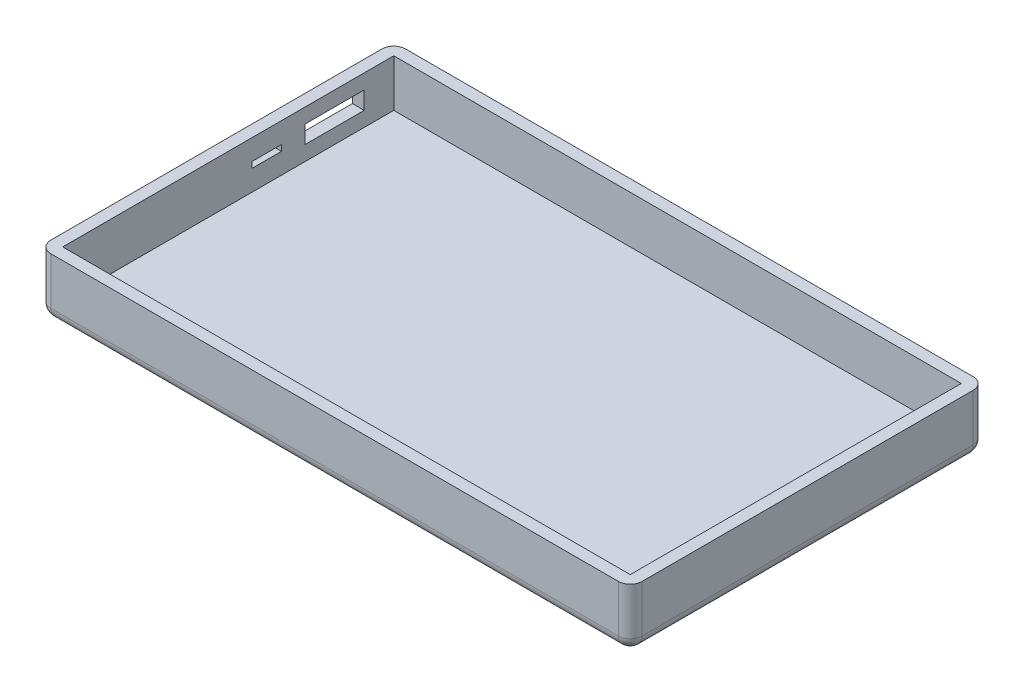
ISO-10303-21;
HEADER;
FILE_DESCRIPTION(('STEP AP214'),'2;1');
FILE_NAME('part.step','',(''),(''),'','','');
FILE_SCHEMA(('AUTOMOTIVE_DESIGN { 1 0 10303 214 1 1 1 1 }'));
ENDSEC;
DATA;
#1=APPLICATION_CONTEXT('core data for automotive mechanical design processes');
#2=APPLICATION_PROTOCOL_DEFINITION('international standard','automotive_design',2000,#1);
#3=PRODUCT_CONTEXT('',#1,'mechanical');
#4=PRODUCT('Part','Part','',(#3));
#5=PRODUCT_RELATED_PRODUCT_CATEGORY('part','',(#4));
#6=PRODUCT_DEFINITION_FORMATION('','',#4);
#7=PRODUCT_DEFINITION_CONTEXT('part definition',#1,'design');
#8=PRODUCT_DEFINITION('design','',#6,#7);
#9=PRODUCT_DEFINITION_SHAPE('','',#8);
#10=(LENGTH_UNIT() NAMED_UNIT(*) SI_UNIT(.MILLI.,.METRE.));
#11=(NAMED_UNIT(*) PLANE_ANGLE_UNIT() SI_UNIT($,.RADIAN.));
#12=(NAMED_UNIT(*) SI_UNIT($,.STERADIAN.) SOLID_ANGLE_UNIT());
#13=UNCERTAINTY_MEASURE_WITH_UNIT(LENGTH_MEASURE(1.E-05),#10,'distance_accuracy_value','');
#14=(GEOMETRIC_REPRESENTATION_CONTEXT(3) GLOBAL_UNCERTAINTY_ASSIGNED_CONTEXT((#13)) GLOBAL_UNIT_ASSIGNED_CONTEXT((#10,
#11,#12)) REPRESENTATION_CONTEXT('',''));
#15=CARTESIAN_POINT('',(0.,0.,0.));
#16=DIRECTION('',(0.,0.,1.));
#17=DIRECTION('',(1.,0.,0.));
#18=AXIS2_PLACEMENT_3D('',#15,#16,#17);
#19=CARTESIAN_POINT('',(-50.,10.,30.));
#20=DIRECTION('',(1.,0.,0.));
#21=DIRECTION('',(0.,0.,-1.));
#22=AXIS2_PLACEMENT_3D('',#19,#20,#21);
#23=PLANE('',#22);
#24=DIRECTION('',(0.,-1.,0.));
#25=VECTOR('',#24,1.);
#26=CARTESIAN_POINT('',(-50.,6.5,-8.99999999999999));
#27=LINE('',#26,#25);
#28=CARTESIAN_POINT('',(-50.,6.5,-8.99999999999999));
#29=VERTEX_POINT('',#28);
#30=CARTESIAN_POINT('',(-50.,5.5,-8.99999999999999));
#31=VERTEX_POINT('',#30);
#32=EDGE_CURVE('E220',#29,#31,#27,.T.);
#33=ORIENTED_EDGE('',*,*,#32,.F.);
#34=DIRECTION('',(0.,0.,-1.));
#35=VECTOR('',#34,1.);
#36=CARTESIAN_POINT('',(-50.,6.5,-8.99999999999999));
#37=LINE('',#36,#35);
#38=CARTESIAN_POINT('',(-50.,6.5,-3.99999999999999));
#39=VERTEX_POINT('',#38);
#40=EDGE_CURVE('E210',#39,#29,#37,.T.);
#41=ORIENTED_EDGE('',*,*,#40,.F.);
#42=DIRECTION('',(0.,1.,0.));
#43=VECTOR('',#42,1.);
#44=CARTESIAN_POINT('',(-50.,6.5,-3.99999999999999));
#45=LINE('',#44,#43);
#46=CARTESIAN_POINT('',(-50.,5.5,-3.99999999999999));
#47=VERTEX_POINT('',#46);
#48=EDGE_CURVE('E224',#47,#39,#45,.T.);
#49=ORIENTED_EDGE('',*,*,#48,.F.);
#50=DIRECTION('',(0.,0.,1.));
#51=VECTOR('',#50,1.);
#52=CARTESIAN_POINT('',(-50.,5.5,-8.99999999999999));
#53=LINE('',#52,#51);
#54=EDGE_CURVE('E57',#31,#47,#53,.T.);
#55=ORIENTED_EDGE('',*,*,#54,.F.);
#56=EDGE_LOOP('',(#33,#41,#49,#55));
#57=FACE_BOUND('',#56,.T.);
#58=DIRECTION('',(0.,1.,0.));
#59=VECTOR('',#58,1.);
#60=CARTESIAN_POINT('',(-50.,4.5,-13.));
#61=LINE('',#60,#59);
#62=CARTESIAN_POINT('',(-50.,4.5,-13.));
#63=VERTEX_POINT('',#62);
#64=CARTESIAN_POINT('',(-50.,7.5,-13.));
#65=VERTEX_POINT('',#64);
#66=EDGE_CURVE('E243',#63,#65,#61,.T.);
#67=ORIENTED_EDGE('',*,*,#66,.F.);
#68=DIRECTION('',(0.,0.,1.));
#69=VECTOR('',#68,1.);
#70=CARTESIAN_POINT('',(-50.,4.5,-13.));
#71=LINE('',#70,#69);
#72=CARTESIAN_POINT('',(-50.,4.5,-23.));
#73=VERTEX_POINT('',#72);
#74=EDGE_CURVE('E247',#73,#63,#71,.T.);
#75=ORIENTED_EDGE('',*,*,#74,.F.);
#76=DIRECTION('',(0.,-1.,0.));
#77=VECTOR('',#76,1.);
#78=CARTESIAN_POINT('',(-50.,4.5,-23.));
#79=LINE('',#78,#77);
#80=CARTESIAN_POINT('',(-50.,7.5,-23.));
#81=VERTEX_POINT('',#80);
#82=EDGE_CURVE('E251',#81,#73,#79,.T.);
#83=ORIENTED_EDGE('',*,*,#82,.F.);
#84=DIRECTION('',(0.,0.,-1.));
#85=VECTOR('',#84,1.);
#86=CARTESIAN_POINT('',(-50.,7.5,-13.));
#87=LINE('',#86,#85);
#88=EDGE_CURVE('E65',#65,#81,#87,.T.);
#89=ORIENTED_EDGE('',*,*,#88,.F.);
#90=EDGE_LOOP('',(#67,#75,#83,#89));
#91=FACE_BOUND('',#90,.T.);
#92=DIRECTION('',(0.,0.,1.));
#93=VECTOR('',#92,1.);
#94=CARTESIAN_POINT('',(-50.,2.,30.));
#95=LINE('',#94,#93);
#96=CARTESIAN_POINT('',(-50.,2.,-28.));
#97=VERTEX_POINT('',#96);
#98=CARTESIAN_POINT('',(-50.,2.,28.));
#99=VERTEX_POINT('',#98);
#100=EDGE_CURVE('E366',#97,#99,#95,.T.);
#101=ORIENTED_EDGE('',*,*,#100,.T.);
#102=DIRECTION('',(0.,-1.,0.));
#103=VECTOR('',#102,1.);
#104=CARTESIAN_POINT('',(-50.,10.,28.));
#105=LINE('',#104,#103);
#106=CARTESIAN_POINT('',(-50.,10.,28.));
#107=VERTEX_POINT('',#106);
#108=EDGE_CURVE('E369',#99,#107,#105,.F.);
#109=ORIENTED_EDGE('',*,*,#108,.T.);
#110=DIRECTION('',(0.,0.,1.));
#111=VECTOR('',#110,1.);
#112=CARTESIAN_POINT('',(-50.,10.,30.));
#113=LINE('',#112,#111);
#114=CARTESIAN_POINT('',(-50.,10.,-28.));
#115=VERTEX_POINT('',#114);
#116=EDGE_CURVE('E291',#115,#107,#113,.T.);
#117=ORIENTED_EDGE('',*,*,#116,.F.);
#118=DIRECTION('',(0.,-1.,0.));
#119=VECTOR('',#118,1.);
#120=CARTESIAN_POINT('',(-50.,10.,-28.));
#121=LINE('',#120,#119);
#122=EDGE_CURVE('E363',#115,#97,#121,.T.);
#123=ORIENTED_EDGE('',*,*,#122,.T.);
#124=EDGE_LOOP('',(#101,#109,#117,#123));
#125=FACE_BOUND('',#124,.T.);
#126=ADVANCED_FACE('F39',(#57,#91,#125),#23,.F.);
#127=CARTESIAN_POINT('',(50.,10.,30.));
#128=DIRECTION('',(0.,0.,-1.));
#129=DIRECTION('',(-1.,0.,0.));
#130=AXIS2_PLACEMENT_3D('',#127,#128,#129);
#131=PLANE('',#130);
#132=DIRECTION('',(1.,0.,0.));
#133=VECTOR('',#132,1.);
#134=CARTESIAN_POINT('',(50.,10.,30.));
#135=LINE('',#134,#133);
#136=CARTESIAN_POINT('',(-48.,10.,30.));
#137=VERTEX_POINT('',#136);
#138=CARTESIAN_POINT('',(48.,10.,30.));
#139=VERTEX_POINT('',#138);
#140=EDGE_CURVE('E328',#137,#139,#135,.T.);
#141=ORIENTED_EDGE('',*,*,#140,.F.);
#142=DIRECTION('',(0.,-1.,0.));
#143=VECTOR('',#142,1.);
#144=CARTESIAN_POINT('',(-48.,10.,30.));
#145=LINE('',#144,#143);
#146=CARTESIAN_POINT('',(-48.,2.,30.));
#147=VERTEX_POINT('',#146);
#148=EDGE_CURVE('E347',#137,#147,#145,.T.);
#149=ORIENTED_EDGE('',*,*,#148,.T.);
#150=DIRECTION('',(1.,0.,0.));
#151=VECTOR('',#150,1.);
#152=CARTESIAN_POINT('',(50.,2.,30.));
#153=LINE('',#152,#151);
#154=CARTESIAN_POINT('',(48.,2.,30.));
#155=VERTEX_POINT('',#154);
#156=EDGE_CURVE('E343',#147,#155,#153,.T.);
#157=ORIENTED_EDGE('',*,*,#156,.T.);
#158=DIRECTION('',(0.,-1.,0.));
#159=VECTOR('',#158,1.);
#160=CARTESIAN_POINT('',(48.,10.,30.));
#161=LINE('',#160,#159);
#162=EDGE_CURVE('E340',#155,#139,#161,.F.);
#163=ORIENTED_EDGE('',*,*,#162,.T.);
#164=EDGE_LOOP('',(#141,#149,#157,#163));
#165=FACE_BOUND('',#164,.T.);
#166=ADVANCED_FACE('F467',(#165),#131,.F.);
#167=CARTESIAN_POINT('',(50.,10.,30.));
#168=DIRECTION('',(-1.,0.,0.));
#169=DIRECTION('',(0.,0.,1.));
#170=AXIS2_PLACEMENT_3D('',#167,#168,#169);
#171=PLANE('',#170);
#172=DIRECTION('',(0.,0.,-1.));
#173=VECTOR('',#172,1.);
#174=CARTESIAN_POINT('',(50.,2.,30.));
#175=LINE('',#174,#173);
#176=CARTESIAN_POINT('',(50.,2.,28.));
#177=VERTEX_POINT('',#176);
#178=CARTESIAN_POINT('',(50.,2.,-28.));
#179=VERTEX_POINT('',#178);
#180=EDGE_CURVE('E49',#177,#179,#175,.T.);
#181=ORIENTED_EDGE('',*,*,#180,.T.);
#182=DIRECTION('',(0.,-1.,0.));
#183=VECTOR('',#182,1.);
#184=CARTESIAN_POINT('',(50.,10.,-28.));
#185=LINE('',#184,#183);
#186=CARTESIAN_POINT('',(50.,10.,-28.));
#187=VERTEX_POINT('',#186);
#188=EDGE_CURVE('E11',#179,#187,#185,.F.);
#189=ORIENTED_EDGE('',*,*,#188,.T.);
#190=DIRECTION('',(0.,0.,-1.));
#191=VECTOR('',#190,1.);
#192=CARTESIAN_POINT('',(50.,10.,30.));
#193=LINE('',#192,#191);
#194=CARTESIAN_POINT('',(50.,10.,28.));
#195=VERTEX_POINT('',#194);
#196=EDGE_CURVE('E332',#195,#187,#193,.T.);
#197=ORIENTED_EDGE('',*,*,#196,.F.);
#198=DIRECTION('',(0.,-1.,0.));
#199=VECTOR('',#198,1.);
#200=CARTESIAN_POINT('',(50.,10.,28.));
#201=LINE('',#200,#199);
#202=EDGE_CURVE('E393',#195,#177,#201,.T.);
#203=ORIENTED_EDGE('',*,*,#202,.T.);
#204=EDGE_LOOP('',(#181,#189,#197,#203));
#205=FACE_BOUND('',#204,.T.);
#206=ADVANCED_FACE('F477',(#205),#171,.F.);
#207=CARTESIAN_POINT('',(50.,10.,-30.));
#208=DIRECTION('',(0.,0.,1.));
#209=DIRECTION('',(1.,0.,0.));
#210=AXIS2_PLACEMENT_3D('',#207,#208,#209);
#211=PLANE('',#210);
#212=DIRECTION('',(-1.,0.,0.));
#213=VECTOR('',#212,1.);
#214=CARTESIAN_POINT('',(50.,2.,-30.));
#215=LINE('',#214,#213);
#216=CARTESIAN_POINT('',(48.,2.,-30.));
#217=VERTEX_POINT('',#216);
#218=CARTESIAN_POINT('',(-48.,2.,-30.));
#219=VERTEX_POINT('',#218);
#220=EDGE_CURVE('E387',#217,#219,#215,.T.);
#221=ORIENTED_EDGE('',*,*,#220,.T.);
#222=DIRECTION('',(0.,-1.,0.));
#223=VECTOR('',#222,1.);
#224=CARTESIAN_POINT('',(-48.,10.,-30.));
#225=LINE('',#224,#223);
#226=CARTESIAN_POINT('',(-48.,10.,-30.));
#227=VERTEX_POINT('',#226);
#228=EDGE_CURVE('E390',#219,#227,#225,.F.);
#229=ORIENTED_EDGE('',*,*,#228,.T.);
#230=DIRECTION('',(-1.,0.,0.));
#231=VECTOR('',#230,1.);
#232=CARTESIAN_POINT('',(50.,10.,-30.));
#233=LINE('',#232,#231);
#234=CARTESIAN_POINT('',(48.,10.,-30.));
#235=VERTEX_POINT('',#234);
#236=EDGE_CURVE('E336',#235,#227,#233,.T.);
#237=ORIENTED_EDGE('',*,*,#236,.F.);
#238=DIRECTION('',(0.,-1.,0.));
#239=VECTOR('',#238,1.);
#240=CARTESIAN_POINT('',(48.,10.,-30.));
#241=LINE('',#240,#239);
#242=EDGE_CURVE('E384',#235,#217,#241,.T.);
#243=ORIENTED_EDGE('',*,*,#242,.T.);
#244=EDGE_LOOP('',(#221,#229,#237,#243));
#245=FACE_BOUND('',#244,.T.);
#246=ADVANCED_FACE('F498',(#245),#211,.F.);
#247=CARTESIAN_POINT('',(0.,10.,0.));
#248=DIRECTION('',(0.,1.,0.));
#249=DIRECTION('',(0.,0.,1.));
#250=AXIS2_PLACEMENT_3D('',#247,#248,#249);
#251=PLANE('',#250);
#252=DIRECTION('',(0.,0.,1.));
#253=VECTOR('',#252,1.);
#254=CARTESIAN_POINT('',(-48.,10.,30.));
#255=LINE('',#254,#253);
#256=CARTESIAN_POINT('',(-48.,10.,-28.));
#257=VERTEX_POINT('',#256);
#258=CARTESIAN_POINT('',(-48.,10.,28.));
#259=VERTEX_POINT('',#258);
#260=EDGE_CURVE('E313',#257,#259,#255,.T.);
#261=ORIENTED_EDGE('',*,*,#260,.F.);
#262=DIRECTION('',(-1.,0.,0.));
#263=VECTOR('',#262,1.);
#264=CARTESIAN_POINT('',(50.,10.,-28.));
#265=LINE('',#264,#263);
#266=CARTESIAN_POINT('',(48.,10.,-28.));
#267=VERTEX_POINT('',#266);
#268=EDGE_CURVE('E298',#267,#257,#265,.T.);
#269=ORIENTED_EDGE('',*,*,#268,.F.);
#270=DIRECTION('',(0.,0.,-1.));
#271=VECTOR('',#270,1.);
#272=CARTESIAN_POINT('',(48.,10.,30.));
#273=LINE('',#272,#271);
#274=CARTESIAN_POINT('',(48.,10.,28.));
#275=VERTEX_POINT('',#274);
#276=EDGE_CURVE('E319',#275,#267,#273,.T.);
#277=ORIENTED_EDGE('',*,*,#276,.F.);
#278=DIRECTION('',(1.,0.,0.));
#279=VECTOR('',#278,1.);
#280=CARTESIAN_POINT('',(50.,10.,28.));
#281=LINE('',#280,#279);
#282=EDGE_CURVE('E316',#259,#275,#281,.T.);
#283=ORIENTED_EDGE('',*,*,#282,.F.);
#284=EDGE_LOOP('',(#261,#269,#277,#283));
#285=FACE_BOUND('',#284,.T.);
#286=ORIENTED_EDGE('',*,*,#116,.T.);
#287=CARTESIAN_POINT('',(-48.,10.,28.));
#288=DIRECTION('',(0.,1.,0.));
#289=DIRECTION('',(0.,0.,1.));
#290=AXIS2_PLACEMENT_3D('',#287,#288,#289);
#291=CIRCLE('',#290,2.);
#292=EDGE_CURVE('E381',#107,#137,#291,.T.);
#293=ORIENTED_EDGE('',*,*,#292,.T.);
#294=ORIENTED_EDGE('',*,*,#140,.T.);
#295=CARTESIAN_POINT('',(48.,10.,28.));
#296=DIRECTION('',(0.,1.,0.));
#297=DIRECTION('',(0.,0.,1.));
#298=AXIS2_PLACEMENT_3D('',#295,#296,#297);
#299=CIRCLE('',#298,2.);
#300=EDGE_CURVE('E372',#139,#195,#299,.T.);
#301=ORIENTED_EDGE('',*,*,#300,.T.);
#302=ORIENTED_EDGE('',*,*,#196,.T.);
#303=CARTESIAN_POINT('',(48.,10.,-28.));
#304=DIRECTION('',(0.,1.,0.));
#305=DIRECTION('',(0.,0.,1.));
#306=AXIS2_PLACEMENT_3D('',#303,#304,#305);
#307=CIRCLE('',#306,2.);
#308=EDGE_CURVE('E375',#187,#235,#307,.T.);
#309=ORIENTED_EDGE('',*,*,#308,.T.);
#310=ORIENTED_EDGE('',*,*,#236,.T.);
#311=CARTESIAN_POINT('',(-48.,10.,-28.));
#312=DIRECTION('',(0.,1.,0.));
#313=DIRECTION('',(0.,0.,1.));
#314=AXIS2_PLACEMENT_3D('',#311,#312,#313);
#315=CIRCLE('',#314,2.);
#316=EDGE_CURVE('E378',#227,#115,#315,.T.);
#317=ORIENTED_EDGE('',*,*,#316,.T.);
#318=EDGE_LOOP('',(#286,#293,#294,#301,#302,#309,#310,#317));
#319=FACE_BOUND('',#318,.T.);
#320=ADVANCED_FACE('F464',(#285,#319),#251,.T.);
#321=CARTESIAN_POINT('',(0.,0.,0.));
#322=DIRECTION('',(0.,1.,0.));
#323=DIRECTION('',(0.,0.,1.));
#324=AXIS2_PLACEMENT_3D('',#321,#322,#323);
#325=PLANE('',#324);
#326=DIRECTION('',(0.,0.,-1.));
#327=VECTOR('',#326,1.);
#328=CARTESIAN_POINT('',(48.,0.,0.));
#329=LINE('',#328,#327);
#330=CARTESIAN_POINT('',(48.,0.,-28.));
#331=VERTEX_POINT('',#330);
#332=CARTESIAN_POINT('',(48.,0.,28.));
#333=VERTEX_POINT('',#332);
#334=EDGE_CURVE('E350',#331,#333,#329,.F.);
#335=ORIENTED_EDGE('',*,*,#334,.T.);
#336=DIRECTION('',(1.,0.,0.));
#337=VECTOR('',#336,1.);
#338=CARTESIAN_POINT('',(0.,0.,28.));
#339=LINE('',#338,#337);
#340=CARTESIAN_POINT('',(-48.,0.,28.));
#341=VERTEX_POINT('',#340);
#342=EDGE_CURVE('E359',#333,#341,#339,.F.);
#343=ORIENTED_EDGE('',*,*,#342,.T.);
#344=DIRECTION('',(0.,0.,1.));
#345=VECTOR('',#344,1.);
#346=CARTESIAN_POINT('',(-48.,0.,0.));
#347=LINE('',#346,#345);
#348=CARTESIAN_POINT('',(-48.,0.,-28.));
#349=VERTEX_POINT('',#348);
#350=EDGE_CURVE('E356',#341,#349,#347,.F.);
#351=ORIENTED_EDGE('',*,*,#350,.T.);
#352=DIRECTION('',(-1.,0.,0.));
#353=VECTOR('',#352,1.);
#354=CARTESIAN_POINT('',(0.,0.,-28.));
#355=LINE('',#354,#353);
#356=EDGE_CURVE('E353',#349,#331,#355,.F.);
#357=ORIENTED_EDGE('',*,*,#356,.T.);
#358=EDGE_LOOP('',(#335,#343,#351,#357));
#359=FACE_BOUND('',#358,.T.);
#360=ADVANCED_FACE('F494',(#359),#325,.F.);
#361=CARTESIAN_POINT('',(-48.,10.,30.));
#362=DIRECTION('',(1.,0.,0.));
#363=DIRECTION('',(0.,0.,-1.));
#364=AXIS2_PLACEMENT_3D('',#361,#362,#363);
#365=PLANE('',#364);
#366=DIRECTION('',(0.,0.,-1.));
#367=VECTOR('',#366,1.);
#368=CARTESIAN_POINT('',(-48.,6.5,-8.99999999999999));
#369=LINE('',#368,#367);
#370=CARTESIAN_POINT('',(-48.,6.5,-3.99999999999999));
#371=VERTEX_POINT('',#370);
#372=CARTESIAN_POINT('',(-48.,6.5,-8.99999999999999));
#373=VERTEX_POINT('',#372);
#374=EDGE_CURVE('E207',#371,#373,#369,.T.);
#375=ORIENTED_EDGE('',*,*,#374,.T.);
#376=DIRECTION('',(0.,-1.,0.));
#377=VECTOR('',#376,1.);
#378=CARTESIAN_POINT('',(-48.,6.5,-8.99999999999999));
#379=LINE('',#378,#377);
#380=CARTESIAN_POINT('',(-48.,5.5,-8.99999999999999));
#381=VERTEX_POINT('',#380);
#382=EDGE_CURVE('E192',#373,#381,#379,.T.);
#383=ORIENTED_EDGE('',*,*,#382,.T.);
#384=DIRECTION('',(0.,0.,1.));
#385=VECTOR('',#384,1.);
#386=CARTESIAN_POINT('',(-48.,5.5,-8.99999999999999));
#387=LINE('',#386,#385);
#388=CARTESIAN_POINT('',(-48.,5.5,-3.99999999999999));
#389=VERTEX_POINT('',#388);
#390=EDGE_CURVE('E230',#381,#389,#387,.T.);
#391=ORIENTED_EDGE('',*,*,#390,.T.);
#392=DIRECTION('',(0.,1.,0.));
#393=VECTOR('',#392,1.);
#394=CARTESIAN_POINT('',(-48.,6.5,-3.99999999999999));
#395=LINE('',#394,#393);
#396=EDGE_CURVE('E216',#389,#371,#395,.T.);
#397=ORIENTED_EDGE('',*,*,#396,.T.);
#398=EDGE_LOOP('',(#375,#383,#391,#397));
#399=FACE_BOUND('',#398,.T.);
#400=DIRECTION('',(0.,0.,1.));
#401=VECTOR('',#400,1.);
#402=CARTESIAN_POINT('',(-48.,4.5,-13.));
#403=LINE('',#402,#401);
#404=CARTESIAN_POINT('',(-48.,4.5,-23.));
#405=VERTEX_POINT('',#404);
#406=CARTESIAN_POINT('',(-48.,4.5,-13.));
#407=VERTEX_POINT('',#406);
#408=EDGE_CURVE('E242',#405,#407,#403,.T.);
#409=ORIENTED_EDGE('',*,*,#408,.T.);
#410=DIRECTION('',(0.,1.,0.));
#411=VECTOR('',#410,1.);
#412=CARTESIAN_POINT('',(-48.,4.5,-13.));
#413=LINE('',#412,#411);
#414=CARTESIAN_POINT('',(-48.,7.5,-13.));
#415=VERTEX_POINT('',#414);
#416=EDGE_CURVE('E270',#407,#415,#413,.T.);
#417=ORIENTED_EDGE('',*,*,#416,.T.);
#418=DIRECTION('',(0.,0.,-1.));
#419=VECTOR('',#418,1.);
#420=CARTESIAN_POINT('',(-48.,7.5,-13.));
#421=LINE('',#420,#419);
#422=CARTESIAN_POINT('',(-48.,7.5,-23.));
#423=VERTEX_POINT('',#422);
#424=EDGE_CURVE('E265',#415,#423,#421,.T.);
#425=ORIENTED_EDGE('',*,*,#424,.T.);
#426=DIRECTION('',(0.,-1.,0.));
#427=VECTOR('',#426,1.);
#428=CARTESIAN_POINT('',(-48.,4.5,-23.));
#429=LINE('',#428,#427);
#430=EDGE_CURVE('E259',#423,#405,#429,.T.);
#431=ORIENTED_EDGE('',*,*,#430,.T.);
#432=EDGE_LOOP('',(#409,#417,#425,#431));
#433=FACE_BOUND('',#432,.T.);
#434=DIRECTION('',(0.,0.,1.));
#435=VECTOR('',#434,1.);
#436=CARTESIAN_POINT('',(-48.,2.,30.));
#437=LINE('',#436,#435);
#438=CARTESIAN_POINT('',(-48.,2.,-28.));
#439=VERTEX_POINT('',#438);
#440=CARTESIAN_POINT('',(-48.,2.,28.));
#441=VERTEX_POINT('',#440);
#442=EDGE_CURVE('E282',#439,#441,#437,.T.);
#443=ORIENTED_EDGE('',*,*,#442,.F.);
#444=DIRECTION('',(0.,-1.,0.));
#445=VECTOR('',#444,1.);
#446=CARTESIAN_POINT('',(-48.,10.,-28.));
#447=LINE('',#446,#445);
#448=EDGE_CURVE('E293',#257,#439,#447,.T.);
#449=ORIENTED_EDGE('',*,*,#448,.F.);
#450=ORIENTED_EDGE('',*,*,#260,.T.);
#451=DIRECTION('',(0.,-1.,0.));
#452=VECTOR('',#451,1.);
#453=CARTESIAN_POINT('',(-48.,10.,28.));
#454=LINE('',#453,#452);
#455=EDGE_CURVE('E287',#259,#441,#454,.T.);
#456=ORIENTED_EDGE('',*,*,#455,.T.);
#457=EDGE_LOOP('',(#443,#449,#450,#456));
#458=FACE_BOUND('',#457,.T.);
#459=ADVANCED_FACE('F214',(#399,#433,#458),#365,.T.);
#460=CARTESIAN_POINT('',(50.,10.,28.));
#461=DIRECTION('',(0.,0.,-1.));
#462=DIRECTION('',(-1.,0.,0.));
#463=AXIS2_PLACEMENT_3D('',#460,#461,#462);
#464=PLANE('',#463);
#465=DIRECTION('',(1.,0.,0.));
#466=VECTOR('',#465,1.);
#467=CARTESIAN_POINT('',(50.,2.,28.));
#468=LINE('',#467,#466);
#469=CARTESIAN_POINT('',(48.,2.,28.));
#470=VERTEX_POINT('',#469);
#471=EDGE_CURVE('E286',#441,#470,#468,.T.);
#472=ORIENTED_EDGE('',*,*,#471,.F.);
#473=ORIENTED_EDGE('',*,*,#455,.F.);
#474=ORIENTED_EDGE('',*,*,#282,.T.);
#475=DIRECTION('',(0.,-1.,0.));
#476=VECTOR('',#475,1.);
#477=CARTESIAN_POINT('',(48.,10.,28.));
#478=LINE('',#477,#476);
#479=EDGE_CURVE('E292',#275,#470,#478,.T.);
#480=ORIENTED_EDGE('',*,*,#479,.T.);
#481=EDGE_LOOP('',(#472,#473,#474,#480));
#482=FACE_BOUND('',#481,.T.);
#483=ADVANCED_FACE('F713',(#482),#464,.T.);
#484=CARTESIAN_POINT('',(48.,10.,30.));
#485=DIRECTION('',(-1.,0.,0.));
#486=DIRECTION('',(0.,0.,1.));
#487=AXIS2_PLACEMENT_3D('',#484,#485,#486);
#488=PLANE('',#487);
#489=DIRECTION('',(0.,0.,-1.));
#490=VECTOR('',#489,1.);
#491=CARTESIAN_POINT('',(48.,2.,30.));
#492=LINE('',#491,#490);
#493=CARTESIAN_POINT('',(48.,2.,-28.));
#494=VERTEX_POINT('',#493);
#495=EDGE_CURVE('E301',#470,#494,#492,.T.);
#496=ORIENTED_EDGE('',*,*,#495,.F.);
#497=ORIENTED_EDGE('',*,*,#479,.F.);
#498=ORIENTED_EDGE('',*,*,#276,.T.);
#499=DIRECTION('',(0.,-1.,0.));
#500=VECTOR('',#499,1.);
#501=CARTESIAN_POINT('',(48.,10.,-28.));
#502=LINE('',#501,#500);
#503=EDGE_CURVE('E297',#267,#494,#502,.T.);
#504=ORIENTED_EDGE('',*,*,#503,.T.);
#505=EDGE_LOOP('',(#496,#497,#498,#504));
#506=FACE_BOUND('',#505,.T.);
#507=ADVANCED_FACE('F704',(#506),#488,.T.);
#508=CARTESIAN_POINT('',(50.,10.,-28.));
#509=DIRECTION('',(0.,0.,1.));
#510=DIRECTION('',(1.,0.,0.));
#511=AXIS2_PLACEMENT_3D('',#508,#509,#510);
#512=PLANE('',#511);
#513=DIRECTION('',(-1.,0.,0.));
#514=VECTOR('',#513,1.);
#515=CARTESIAN_POINT('',(50.,2.,-28.));
#516=LINE('',#515,#514);
#517=EDGE_CURVE('E307',#494,#439,#516,.T.);
#518=ORIENTED_EDGE('',*,*,#517,.F.);
#519=ORIENTED_EDGE('',*,*,#503,.F.);
#520=ORIENTED_EDGE('',*,*,#268,.T.);
#521=ORIENTED_EDGE('',*,*,#448,.T.);
#522=EDGE_LOOP('',(#518,#519,#520,#521));
#523=FACE_BOUND('',#522,.T.);
#524=ADVANCED_FACE('F508',(#523),#512,.T.);
#525=CARTESIAN_POINT('',(0.,2.,0.));
#526=DIRECTION('',(0.,1.,0.));
#527=DIRECTION('',(0.,0.,1.));
#528=AXIS2_PLACEMENT_3D('',#525,#526,#527);
#529=PLANE('',#528);
#530=ORIENTED_EDGE('',*,*,#442,.T.);
#531=ORIENTED_EDGE('',*,*,#471,.T.);
#532=ORIENTED_EDGE('',*,*,#495,.T.);
#533=ORIENTED_EDGE('',*,*,#517,.T.);
#534=EDGE_LOOP('',(#530,#531,#532,#533));
#535=FACE_BOUND('',#534,.T.);
#536=ADVANCED_FACE('F503',(#535),#529,.T.);
#537=CARTESIAN_POINT('',(-48.,10.,-28.));
#538=DIRECTION('',(0.,-1.,0.));
#539=DIRECTION('',(0.,0.,-1.));
#540=AXIS2_PLACEMENT_3D('',#537,#538,#539);
#541=CYLINDRICAL_SURFACE('',#540,2.);
#542=ORIENTED_EDGE('',*,*,#316,.F.);
#543=ORIENTED_EDGE('',*,*,#228,.F.);
#544=CARTESIAN_POINT('',(-48.,2.,-28.));
#545=DIRECTION('',(0.,-1.,0.));
#546=DIRECTION('',(0.,0.,-1.));
#547=AXIS2_PLACEMENT_3D('',#544,#545,#546);
#548=CIRCLE('',#547,2.);
#549=EDGE_CURVE('E434',#97,#219,#548,.T.);
#550=ORIENTED_EDGE('',*,*,#549,.F.);
#551=ORIENTED_EDGE('',*,*,#122,.F.);
#552=EDGE_LOOP('',(#542,#543,#550,#551));
#553=FACE_BOUND('',#552,.T.);
#554=ADVANCED_FACE('F41',(#553),#541,.T.);
#555=CARTESIAN_POINT('',(48.,10.,-28.));
#556=DIRECTION('',(0.,-1.,0.));
#557=DIRECTION('',(0.,0.,-1.));
#558=AXIS2_PLACEMENT_3D('',#555,#556,#557);
#559=CYLINDRICAL_SURFACE('',#558,2.);
#560=ORIENTED_EDGE('',*,*,#308,.F.);
#561=ORIENTED_EDGE('',*,*,#188,.F.);
#562=CARTESIAN_POINT('',(48.,2.,-28.));
#563=DIRECTION('',(0.,-1.,0.));
#564=DIRECTION('',(0.,0.,-1.));
#565=AXIS2_PLACEMENT_3D('',#562,#563,#564);
#566=CIRCLE('',#565,2.);
#567=EDGE_CURVE('E431',#217,#179,#566,.T.);
#568=ORIENTED_EDGE('',*,*,#567,.F.);
#569=ORIENTED_EDGE('',*,*,#242,.F.);
#570=EDGE_LOOP('',(#560,#561,#568,#569));
#571=FACE_BOUND('',#570,.T.);
#572=ADVANCED_FACE('F482',(#571),#559,.T.);
#573=CARTESIAN_POINT('',(50.,2.,-28.));
#574=DIRECTION('',(-1.,0.,0.));
#575=DIRECTION('',(0.,0.,1.));
#576=AXIS2_PLACEMENT_3D('',#573,#574,#575);
#577=CYLINDRICAL_SURFACE('',#576,2.);
#578=CARTESIAN_POINT('',(-48.,2.,-28.));
#579=DIRECTION('',(-1.,0.,0.));
#580=DIRECTION('',(0.,0.,1.));
#581=AXIS2_PLACEMENT_3D('',#578,#579,#580);
#582=CIRCLE('',#581,2.);
#583=EDGE_CURVE('E43',#219,#349,#582,.T.);
#584=ORIENTED_EDGE('',*,*,#583,.F.);
#585=ORIENTED_EDGE('',*,*,#220,.F.);
#586=CARTESIAN_POINT('',(48.,2.,-28.));
#587=DIRECTION('',(1.,0.,0.));
#588=DIRECTION('',(0.,0.,-1.));
#589=AXIS2_PLACEMENT_3D('',#586,#587,#588);
#590=CIRCLE('',#589,2.);
#591=EDGE_CURVE('E427',#331,#217,#590,.T.);
#592=ORIENTED_EDGE('',*,*,#591,.F.);
#593=ORIENTED_EDGE('',*,*,#356,.F.);
#594=EDGE_LOOP('',(#584,#585,#592,#593));
#595=FACE_BOUND('',#594,.T.);
#596=ADVANCED_FACE('F495',(#595),#577,.T.);
#597=CARTESIAN_POINT('',(-48.,2.,-28.));
#598=DIRECTION('',(0.,0.,1.));
#599=DIRECTION('',(1.,0.,0.));
#600=AXIS2_PLACEMENT_3D('',#597,#598,#599);
#601=SPHERICAL_SURFACE('',#600,2.);
#602=ORIENTED_EDGE('',*,*,#549,.T.);
#603=ORIENTED_EDGE('',*,*,#583,.T.);
#604=CARTESIAN_POINT('',(-48.,2.,-28.));
#605=DIRECTION('',(0.,0.,-1.));
#606=DIRECTION('',(-1.,0.,0.));
#607=AXIS2_PLACEMENT_3D('',#604,#605,#606);
#608=CIRCLE('',#607,2.);
#609=EDGE_CURVE('E423',#97,#349,#608,.F.);
#610=ORIENTED_EDGE('',*,*,#609,.F.);
#611=EDGE_LOOP('',(#602,#603,#610));
#612=FACE_BOUND('',#611,.T.);
#613=ADVANCED_FACE('F443',(#612),#601,.T.);
#614=CARTESIAN_POINT('',(48.,2.,-28.));
#615=DIRECTION('',(0.,0.,1.));
#616=DIRECTION('',(1.,0.,0.));
#617=AXIS2_PLACEMENT_3D('',#614,#615,#616);
#618=SPHERICAL_SURFACE('',#617,2.);
#619=ORIENTED_EDGE('',*,*,#591,.T.);
#620=ORIENTED_EDGE('',*,*,#567,.T.);
#621=CARTESIAN_POINT('',(48.,2.,-28.));
#622=DIRECTION('',(0.,0.,-1.));
#623=DIRECTION('',(-1.,0.,0.));
#624=AXIS2_PLACEMENT_3D('',#621,#622,#623);
#625=CIRCLE('',#624,2.);
#626=EDGE_CURVE('E419',#331,#179,#625,.F.);
#627=ORIENTED_EDGE('',*,*,#626,.F.);
#628=EDGE_LOOP('',(#619,#620,#627));
#629=FACE_BOUND('',#628,.T.);
#630=ADVANCED_FACE('F486',(#629),#618,.T.);
#631=CARTESIAN_POINT('',(-48.,2.,30.));
#632=DIRECTION('',(0.,0.,1.));
#633=DIRECTION('',(1.,0.,0.));
#634=AXIS2_PLACEMENT_3D('',#631,#632,#633);
#635=CYLINDRICAL_SURFACE('',#634,2.);
#636=ORIENTED_EDGE('',*,*,#609,.T.);
#637=ORIENTED_EDGE('',*,*,#350,.F.);
#638=CARTESIAN_POINT('',(-48.,2.,28.));
#639=DIRECTION('',(0.,0.,1.));
#640=DIRECTION('',(1.,0.,0.));
#641=AXIS2_PLACEMENT_3D('',#638,#639,#640);
#642=CIRCLE('',#641,2.);
#643=EDGE_CURVE('E415',#99,#341,#642,.T.);
#644=ORIENTED_EDGE('',*,*,#643,.F.);
#645=ORIENTED_EDGE('',*,*,#100,.F.);
#646=EDGE_LOOP('',(#636,#637,#644,#645));
#647=FACE_BOUND('',#646,.T.);
#648=ADVANCED_FACE('F450',(#647),#635,.T.);
#649=CARTESIAN_POINT('',(-48.,10.,28.));
#650=DIRECTION('',(0.,-1.,0.));
#651=DIRECTION('',(0.,0.,-1.));
#652=AXIS2_PLACEMENT_3D('',#649,#650,#651);
#653=CYLINDRICAL_SURFACE('',#652,2.);
#654=ORIENTED_EDGE('',*,*,#292,.F.);
#655=ORIENTED_EDGE('',*,*,#108,.F.);
#656=CARTESIAN_POINT('',(-48.,2.,28.));
#657=DIRECTION('',(0.,-1.,0.));
#658=DIRECTION('',(0.,0.,-1.));
#659=AXIS2_PLACEMENT_3D('',#656,#657,#658);
#660=CIRCLE('',#659,2.);
#661=EDGE_CURVE('E411',#147,#99,#660,.T.);
#662=ORIENTED_EDGE('',*,*,#661,.F.);
#663=ORIENTED_EDGE('',*,*,#148,.F.);
#664=EDGE_LOOP('',(#654,#655,#662,#663));
#665=FACE_BOUND('',#664,.T.);
#666=ADVANCED_FACE('F459',(#665),#653,.T.);
#667=CARTESIAN_POINT('',(48.,10.,28.));
#668=DIRECTION('',(0.,-1.,0.));
#669=DIRECTION('',(0.,0.,-1.));
#670=AXIS2_PLACEMENT_3D('',#667,#668,#669);
#671=CYLINDRICAL_SURFACE('',#670,2.);
#672=ORIENTED_EDGE('',*,*,#300,.F.);
#673=ORIENTED_EDGE('',*,*,#162,.F.);
#674=CARTESIAN_POINT('',(48.,2.,28.));
#675=DIRECTION('',(0.,-1.,0.));
#676=DIRECTION('',(0.,0.,-1.));
#677=AXIS2_PLACEMENT_3D('',#674,#675,#676);
#678=CIRCLE('',#677,2.);
#679=EDGE_CURVE('E407',#177,#155,#678,.T.);
#680=ORIENTED_EDGE('',*,*,#679,.F.);
#681=ORIENTED_EDGE('',*,*,#202,.F.);
#682=EDGE_LOOP('',(#672,#673,#680,#681));
#683=FACE_BOUND('',#682,.T.);
#684=ADVANCED_FACE('F472',(#683),#671,.T.);
#685=CARTESIAN_POINT('',(48.,2.,30.));
#686=DIRECTION('',(0.,0.,-1.));
#687=DIRECTION('',(-1.,0.,0.));
#688=AXIS2_PLACEMENT_3D('',#685,#686,#687);
#689=CYLINDRICAL_SURFACE('',#688,2.);
#690=ORIENTED_EDGE('',*,*,#626,.T.);
#691=ORIENTED_EDGE('',*,*,#180,.F.);
#692=CARTESIAN_POINT('',(48.,2.,28.));
#693=DIRECTION('',(0.,0.,1.));
#694=DIRECTION('',(1.,0.,0.));
#695=AXIS2_PLACEMENT_3D('',#692,#693,#694);
#696=CIRCLE('',#695,2.);
#697=EDGE_CURVE('E403',#333,#177,#696,.T.);
#698=ORIENTED_EDGE('',*,*,#697,.F.);
#699=ORIENTED_EDGE('',*,*,#334,.F.);
#700=EDGE_LOOP('',(#690,#691,#698,#699));
#701=FACE_BOUND('',#700,.T.);
#702=ADVANCED_FACE('F490',(#701),#689,.T.);
#703=CARTESIAN_POINT('',(-48.,2.,28.));
#704=DIRECTION('',(0.,0.,1.));
#705=DIRECTION('',(1.,0.,0.));
#706=AXIS2_PLACEMENT_3D('',#703,#704,#705);
#707=SPHERICAL_SURFACE('',#706,2.);
#708=ORIENTED_EDGE('',*,*,#661,.T.);
#709=ORIENTED_EDGE('',*,*,#643,.T.);
#710=CARTESIAN_POINT('',(-48.,2.,28.));
#711=DIRECTION('',(-1.,0.,0.));
#712=DIRECTION('',(0.,0.,1.));
#713=AXIS2_PLACEMENT_3D('',#710,#711,#712);
#714=CIRCLE('',#713,2.);
#715=EDGE_CURVE('E400',#147,#341,#714,.F.);
#716=ORIENTED_EDGE('',*,*,#715,.F.);
#717=EDGE_LOOP('',(#708,#709,#716));
#718=FACE_BOUND('',#717,.T.);
#719=ADVANCED_FACE('F529',(#718),#707,.T.);
#720=CARTESIAN_POINT('',(48.,2.,28.));
#721=DIRECTION('',(0.,0.,1.));
#722=DIRECTION('',(1.,0.,0.));
#723=AXIS2_PLACEMENT_3D('',#720,#721,#722);
#724=SPHERICAL_SURFACE('',#723,2.);
#725=ORIENTED_EDGE('',*,*,#697,.T.);
#726=ORIENTED_EDGE('',*,*,#679,.T.);
#727=CARTESIAN_POINT('',(48.,2.,28.));
#728=DIRECTION('',(1.,0.,0.));
#729=DIRECTION('',(0.,0.,-1.));
#730=AXIS2_PLACEMENT_3D('',#727,#728,#729);
#731=CIRCLE('',#730,2.);
#732=EDGE_CURVE('E239',#333,#155,#731,.F.);
#733=ORIENTED_EDGE('',*,*,#732,.F.);
#734=EDGE_LOOP('',(#725,#726,#733));
#735=FACE_BOUND('',#734,.T.);
#736=ADVANCED_FACE('F525',(#735),#724,.T.);
#737=CARTESIAN_POINT('',(50.,2.,28.));
#738=DIRECTION('',(1.,0.,0.));
#739=DIRECTION('',(0.,0.,-1.));
#740=AXIS2_PLACEMENT_3D('',#737,#738,#739);
#741=CYLINDRICAL_SURFACE('',#740,2.);
#742=ORIENTED_EDGE('',*,*,#715,.T.);
#743=ORIENTED_EDGE('',*,*,#342,.F.);
#744=ORIENTED_EDGE('',*,*,#732,.T.);
#745=ORIENTED_EDGE('',*,*,#156,.F.);
#746=EDGE_LOOP('',(#742,#743,#744,#745));
#747=FACE_BOUND('',#746,.T.);
#748=ADVANCED_FACE('F521',(#747),#741,.T.);
#749=CARTESIAN_POINT('',(-37.5596934910895,4.5,-13.));
#750=DIRECTION('',(0.,-1.,0.));
#751=DIRECTION('',(0.,0.,-1.));
#752=AXIS2_PLACEMENT_3D('',#749,#750,#751);
#753=PLANE('',#752);
#754=DIRECTION('',(-1.,0.,0.));
#755=VECTOR('',#754,1.);
#756=CARTESIAN_POINT('',(-37.5596934910895,4.5,-23.));
#757=LINE('',#756,#755);
#758=EDGE_CURVE('E263',#405,#73,#757,.T.);
#759=ORIENTED_EDGE('',*,*,#758,.T.);
#760=ORIENTED_EDGE('',*,*,#74,.T.);
#761=DIRECTION('',(-1.,0.,0.));
#762=VECTOR('',#761,1.);
#763=CARTESIAN_POINT('',(-37.5596934910895,4.5,-13.));
#764=LINE('',#763,#762);
#765=EDGE_CURVE('E258',#407,#63,#764,.T.);
#766=ORIENTED_EDGE('',*,*,#765,.F.);
#767=ORIENTED_EDGE('',*,*,#408,.F.);
#768=EDGE_LOOP('',(#759,#760,#766,#767));
#769=FACE_BOUND('',#768,.T.);
#770=ADVANCED_FACE('F524',(#769),#753,.F.);
#771=CARTESIAN_POINT('',(-37.5596934910895,4.5,-13.));
#772=DIRECTION('',(0.,0.,1.));
#773=DIRECTION('',(1.,0.,0.));
#774=AXIS2_PLACEMENT_3D('',#771,#772,#773);
#775=PLANE('',#774);
#776=ORIENTED_EDGE('',*,*,#765,.T.);
#777=ORIENTED_EDGE('',*,*,#66,.T.);
#778=DIRECTION('',(-1.,0.,0.));
#779=VECTOR('',#778,1.);
#780=CARTESIAN_POINT('',(-37.5596934910895,7.5,-13.));
#781=LINE('',#780,#779);
#782=EDGE_CURVE('E269',#415,#65,#781,.T.);
#783=ORIENTED_EDGE('',*,*,#782,.F.);
#784=ORIENTED_EDGE('',*,*,#416,.F.);
#785=EDGE_LOOP('',(#776,#777,#783,#784));
#786=FACE_BOUND('',#785,.T.);
#787=ADVANCED_FACE('F593',(#786),#775,.F.);
#788=CARTESIAN_POINT('',(-37.5596934910895,7.5,-13.));
#789=DIRECTION('',(0.,1.,0.));
#790=DIRECTION('',(0.,0.,1.));
#791=AXIS2_PLACEMENT_3D('',#788,#789,#790);
#792=PLANE('',#791);
#793=ORIENTED_EDGE('',*,*,#782,.T.);
#794=ORIENTED_EDGE('',*,*,#88,.T.);
#795=DIRECTION('',(-1.,0.,0.));
#796=VECTOR('',#795,1.);
#797=CARTESIAN_POINT('',(-37.5596934910895,7.5,-23.));
#798=LINE('',#797,#796);
#799=EDGE_CURVE('E264',#423,#81,#798,.T.);
#800=ORIENTED_EDGE('',*,*,#799,.F.);
#801=ORIENTED_EDGE('',*,*,#424,.F.);
#802=EDGE_LOOP('',(#793,#794,#800,#801));
#803=FACE_BOUND('',#802,.T.);
#804=ADVANCED_FACE('F602',(#803),#792,.F.);
#805=CARTESIAN_POINT('',(-37.5596934910895,4.5,-23.));
#806=DIRECTION('',(0.,0.,-1.));
#807=DIRECTION('',(-1.,0.,0.));
#808=AXIS2_PLACEMENT_3D('',#805,#806,#807);
#809=PLANE('',#808);
#810=ORIENTED_EDGE('',*,*,#799,.T.);
#811=ORIENTED_EDGE('',*,*,#82,.T.);
#812=ORIENTED_EDGE('',*,*,#758,.F.);
#813=ORIENTED_EDGE('',*,*,#430,.F.);
#814=EDGE_LOOP('',(#810,#811,#812,#813));
#815=FACE_BOUND('',#814,.T.);
#816=ADVANCED_FACE('F610',(#815),#809,.F.);
#817=CARTESIAN_POINT('',(-37.5596934910895,6.5,-8.99999999999999));
#818=DIRECTION('',(0.,1.,0.));
#819=DIRECTION('',(0.,0.,1.));
#820=AXIS2_PLACEMENT_3D('',#817,#818,#819);
#821=PLANE('',#820);
#822=DIRECTION('',(-1.,0.,0.));
#823=VECTOR('',#822,1.);
#824=CARTESIAN_POINT('',(-37.5596934910895,6.5,-3.99999999999999));
#825=LINE('',#824,#823);
#826=EDGE_CURVE('E228',#371,#39,#825,.T.);
#827=ORIENTED_EDGE('',*,*,#826,.T.);
#828=ORIENTED_EDGE('',*,*,#40,.T.);
#829=DIRECTION('',(-1.,0.,0.));
#830=VECTOR('',#829,1.);
#831=CARTESIAN_POINT('',(-37.5596934910895,6.5,-8.99999999999999));
#832=LINE('',#831,#830);
#833=EDGE_CURVE('E196',#373,#29,#832,.T.);
#834=ORIENTED_EDGE('',*,*,#833,.F.);
#835=ORIENTED_EDGE('',*,*,#374,.F.);
#836=EDGE_LOOP('',(#827,#828,#834,#835));
#837=FACE_BOUND('',#836,.T.);
#838=ADVANCED_FACE('F206',(#837),#821,.F.);
#839=CARTESIAN_POINT('',(-37.5596934910895,6.5,-8.99999999999999));
#840=DIRECTION('',(0.,0.,-1.));
#841=DIRECTION('',(0.,1.,0.));
#842=AXIS2_PLACEMENT_3D('',#839,#840,#841);
#843=PLANE('',#842);
#844=ORIENTED_EDGE('',*,*,#833,.T.);
#845=ORIENTED_EDGE('',*,*,#32,.T.);
#846=DIRECTION('',(-1.,0.,0.));
#847=VECTOR('',#846,1.);
#848=CARTESIAN_POINT('',(-37.5596934910895,5.5,-8.99999999999999));
#849=LINE('',#848,#847);
#850=EDGE_CURVE('E198',#381,#31,#849,.T.);
#851=ORIENTED_EDGE('',*,*,#850,.F.);
#852=ORIENTED_EDGE('',*,*,#382,.F.);
#853=EDGE_LOOP('',(#844,#845,#851,#852));
#854=FACE_BOUND('',#853,.T.);
#855=ADVANCED_FACE('F194',(#854),#843,.F.);
#856=CARTESIAN_POINT('',(-37.5596934910895,5.5,-8.99999999999999));
#857=DIRECTION('',(0.,-1.,0.));
#858=DIRECTION('',(0.,0.,-1.));
#859=AXIS2_PLACEMENT_3D('',#856,#857,#858);
#860=PLANE('',#859);
#861=ORIENTED_EDGE('',*,*,#850,.T.);
#862=ORIENTED_EDGE('',*,*,#54,.T.);
#863=DIRECTION('',(-1.,0.,0.));
#864=VECTOR('',#863,1.);
#865=CARTESIAN_POINT('',(-37.5596934910895,5.5,-3.99999999999999));
#866=LINE('',#865,#864);
#867=EDGE_CURVE('E229',#389,#47,#866,.T.);
#868=ORIENTED_EDGE('',*,*,#867,.F.);
#869=ORIENTED_EDGE('',*,*,#390,.F.);
#870=EDGE_LOOP('',(#861,#862,#868,#869));
#871=FACE_BOUND('',#870,.T.);
#872=ADVANCED_FACE('F630',(#871),#860,.F.);
#873=CARTESIAN_POINT('',(-37.5596934910895,6.5,-3.99999999999999));
#874=DIRECTION('',(0.,0.,1.));
#875=DIRECTION('',(1.,0.,0.));
#876=AXIS2_PLACEMENT_3D('',#873,#874,#875);
#877=PLANE('',#876);
#878=ORIENTED_EDGE('',*,*,#867,.T.);
#879=ORIENTED_EDGE('',*,*,#48,.T.);
#880=ORIENTED_EDGE('',*,*,#826,.F.);
#881=ORIENTED_EDGE('',*,*,#396,.F.);
#882=EDGE_LOOP('',(#878,#879,#880,#881));
#883=FACE_BOUND('',#882,.T.);
#884=ADVANCED_FACE('F637',(#883),#877,.F.);
#885=CLOSED_SHELL('',(#126,#166,#206,#246,#320,#360,#459,#483,#507,#524,#536,#554,#572,#596,
#613,#630,#648,#666,#684,#702,#719,#736,#748,#770,#787,#804,#816,#838,#855,#872,#884));
#886=MANIFOLD_SOLID_BREP('B2',#885);
#887=ADVANCED_BREP_SHAPE_REPRESENTATION('',(#18,#886),#14);
#888=SHAPE_DEFINITION_REPRESENTATION(#9,#887);
ENDSEC;
END-ISO-10303-21;
